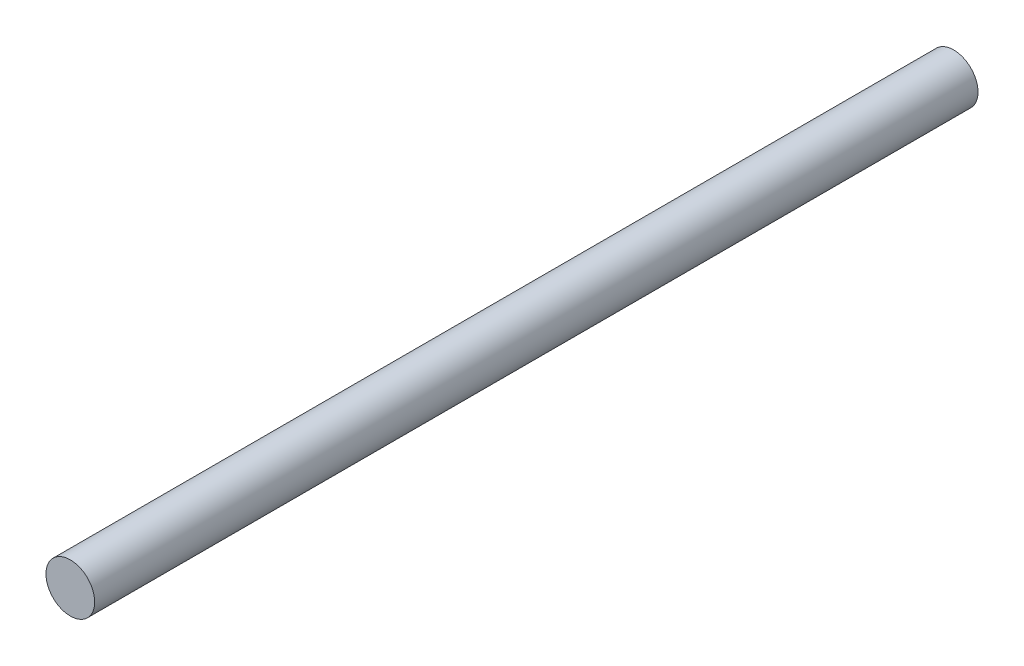
ISO-10303-21;
HEADER;
FILE_DESCRIPTION(('STEP AP214'),'2;1');
FILE_NAME('part.step','',(''),(''),'','','');
FILE_SCHEMA(('AUTOMOTIVE_DESIGN { 1 0 10303 214 1 1 1 1 }'));
ENDSEC;
DATA;
#1=APPLICATION_CONTEXT('core data for automotive mechanical design processes');
#2=APPLICATION_PROTOCOL_DEFINITION('international standard','automotive_design',2000,#1);
#3=PRODUCT_CONTEXT('',#1,'mechanical');
#4=PRODUCT('Part','Part','',(#3));
#5=PRODUCT_RELATED_PRODUCT_CATEGORY('part','',(#4));
#6=PRODUCT_DEFINITION_FORMATION('','',#4);
#7=PRODUCT_DEFINITION_CONTEXT('part definition',#1,'design');
#8=PRODUCT_DEFINITION('design','',#6,#7);
#9=PRODUCT_DEFINITION_SHAPE('','',#8);
#10=(LENGTH_UNIT() NAMED_UNIT(*) SI_UNIT(.MILLI.,.METRE.));
#11=(NAMED_UNIT(*) PLANE_ANGLE_UNIT() SI_UNIT($,.RADIAN.));
#12=(NAMED_UNIT(*) SI_UNIT($,.STERADIAN.) SOLID_ANGLE_UNIT());
#13=UNCERTAINTY_MEASURE_WITH_UNIT(LENGTH_MEASURE(1.E-05),#10,'distance_accuracy_value','');
#14=(GEOMETRIC_REPRESENTATION_CONTEXT(3) GLOBAL_UNCERTAINTY_ASSIGNED_CONTEXT((#13)) GLOBAL_UNIT_ASSIGNED_CONTEXT((#10,
#11,#12)) REPRESENTATION_CONTEXT('',''));
#15=CARTESIAN_POINT('',(0.,0.,0.));
#16=DIRECTION('',(0.,0.,1.));
#17=DIRECTION('',(1.,0.,0.));
#18=AXIS2_PLACEMENT_3D('',#15,#16,#17);
#19=CARTESIAN_POINT('',(0.,0.,72.5));
#20=DIRECTION('',(0.,0.,-1.));
#21=DIRECTION('',(-1.,0.,0.));
#22=AXIS2_PLACEMENT_3D('',#19,#20,#21);
#23=CYLINDRICAL_SURFACE('',#22,4.);
#24=CARTESIAN_POINT('',(0.,0.,72.5));
#25=DIRECTION('',(0.,0.,1.));
#26=DIRECTION('',(1.,0.,0.));
#27=AXIS2_PLACEMENT_3D('',#24,#25,#26);
#28=CIRCLE('',#27,4.);
#29=CARTESIAN_POINT('',(4.,0.,72.5));
#30=VERTEX_POINT('',#29);
#31=EDGE_CURVE('E10',#30,#30,#28,.T.);
#32=ORIENTED_EDGE('',*,*,#31,.F.);
#33=EDGE_LOOP('',(#32));
#34=FACE_BOUND('',#33,.T.);
#35=CARTESIAN_POINT('',(0.,0.,-72.5));
#36=DIRECTION('',(0.,0.,1.));
#37=DIRECTION('',(1.,0.,0.));
#38=AXIS2_PLACEMENT_3D('',#35,#36,#37);
#39=CIRCLE('',#38,4.);
#40=CARTESIAN_POINT('',(4.,0.,-72.5));
#41=VERTEX_POINT('',#40);
#42=EDGE_CURVE('E35',#41,#41,#39,.T.);
#43=ORIENTED_EDGE('',*,*,#42,.T.);
#44=EDGE_LOOP('',(#43));
#45=FACE_BOUND('',#44,.T.);
#46=ADVANCED_FACE('F32',(#34,#45),#23,.T.);
#47=CARTESIAN_POINT('',(0.,0.,72.5));
#48=DIRECTION('',(0.,0.,1.));
#49=DIRECTION('',(1.,0.,0.));
#50=AXIS2_PLACEMENT_3D('',#47,#48,#49);
#51=PLANE('',#50);
#52=ORIENTED_EDGE('',*,*,#31,.T.);
#53=EDGE_LOOP('',(#52));
#54=FACE_BOUND('',#53,.T.);
#55=ADVANCED_FACE('F47',(#54),#51,.T.);
#56=CARTESIAN_POINT('',(0.,0.,-72.5));
#57=DIRECTION('',(0.,0.,1.));
#58=DIRECTION('',(1.,0.,0.));
#59=AXIS2_PLACEMENT_3D('',#56,#57,#58);
#60=PLANE('',#59);
#61=ORIENTED_EDGE('',*,*,#42,.F.);
#62=EDGE_LOOP('',(#61));
#63=FACE_BOUND('',#62,.T.);
#64=ADVANCED_FACE('F45',(#63),#60,.F.);
#65=CLOSED_SHELL('',(#46,#55,#64));
#66=MANIFOLD_SOLID_BREP('B2',#65);
#67=ADVANCED_BREP_SHAPE_REPRESENTATION('',(#18,#66),#14);
#68=SHAPE_DEFINITION_REPRESENTATION(#9,#67);
ENDSEC;
END-ISO-10303-21;
